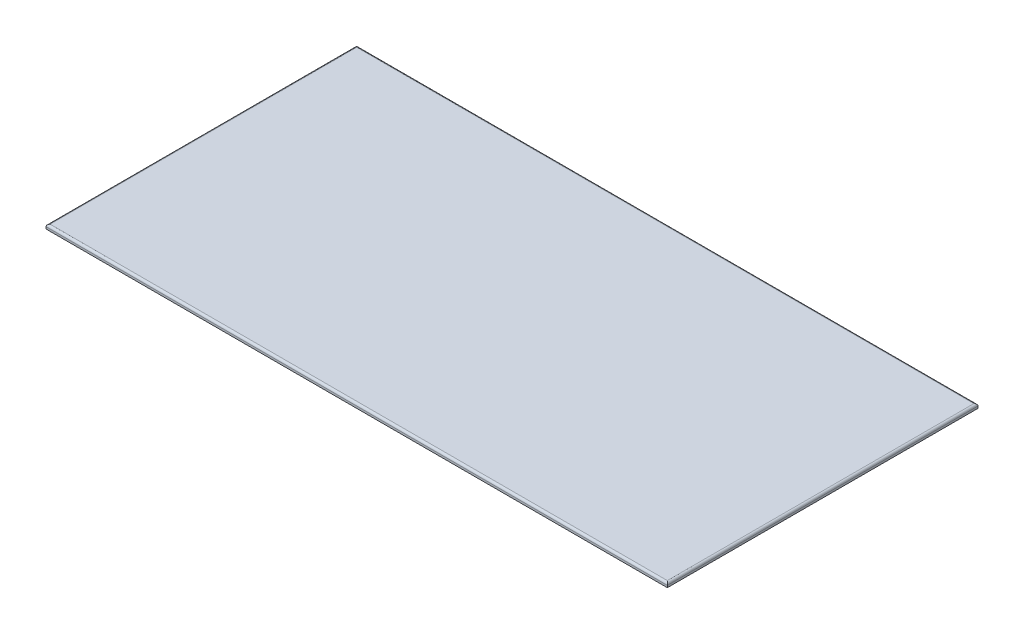
ISO-10303-21;
HEADER;
FILE_DESCRIPTION(('STEP AP214'),'2;1');
FILE_NAME('part.step','',(''),(''),'','','');
FILE_SCHEMA(('AUTOMOTIVE_DESIGN { 1 0 10303 214 1 1 1 1 }'));
ENDSEC;
DATA;
#1=APPLICATION_CONTEXT('core data for automotive mechanical design processes');
#2=APPLICATION_PROTOCOL_DEFINITION('international standard','automotive_design',2000,#1);
#3=PRODUCT_CONTEXT('',#1,'mechanical');
#4=PRODUCT('Part','Part','',(#3));
#5=PRODUCT_RELATED_PRODUCT_CATEGORY('part','',(#4));
#6=PRODUCT_DEFINITION_FORMATION('','',#4);
#7=PRODUCT_DEFINITION_CONTEXT('part definition',#1,'design');
#8=PRODUCT_DEFINITION('design','',#6,#7);
#9=PRODUCT_DEFINITION_SHAPE('','',#8);
#10=(LENGTH_UNIT() NAMED_UNIT(*) SI_UNIT(.MILLI.,.METRE.));
#11=(NAMED_UNIT(*) PLANE_ANGLE_UNIT() SI_UNIT($,.RADIAN.));
#12=(NAMED_UNIT(*) SI_UNIT($,.STERADIAN.) SOLID_ANGLE_UNIT());
#13=UNCERTAINTY_MEASURE_WITH_UNIT(LENGTH_MEASURE(1.E-05),#10,'distance_accuracy_value','');
#14=(GEOMETRIC_REPRESENTATION_CONTEXT(3) GLOBAL_UNCERTAINTY_ASSIGNED_CONTEXT((#13)) GLOBAL_UNIT_ASSIGNED_CONTEXT((#10,
#11,#12)) REPRESENTATION_CONTEXT('',''));
#15=CARTESIAN_POINT('',(0.,0.,0.));
#16=DIRECTION('',(0.,0.,1.));
#17=DIRECTION('',(1.,0.,0.));
#18=AXIS2_PLACEMENT_3D('',#15,#16,#17);
#19=CARTESIAN_POINT('',(0.,8.,0.));
#20=DIRECTION('',(1.,0.,0.));
#21=DIRECTION('',(0.,0.,-1.));
#22=AXIS2_PLACEMENT_3D('',#19,#20,#21);
#23=PLANE('',#22);
#24=DIRECTION('',(0.,-1.,0.));
#25=VECTOR('',#24,1.);
#26=CARTESIAN_POINT('',(0.,8.,0.));
#27=LINE('',#26,#25);
#28=CARTESIAN_POINT('',(0.,4.,0.));
#29=VERTEX_POINT('',#28);
#30=CARTESIAN_POINT('',(0.,0.,0.));
#31=VERTEX_POINT('',#30);
#32=EDGE_CURVE('E92',#29,#31,#27,.T.);
#33=ORIENTED_EDGE('',*,*,#32,.F.);
#34=DIRECTION('',(0.,0.,1.));
#35=VECTOR('',#34,1.);
#36=CARTESIAN_POINT('',(0.,4.,0.));
#37=LINE('',#36,#35);
#38=CARTESIAN_POINT('',(0.,4.,-600.));
#39=VERTEX_POINT('',#38);
#40=EDGE_CURVE('E11',#29,#39,#37,.F.);
#41=ORIENTED_EDGE('',*,*,#40,.T.);
#42=DIRECTION('',(0.,-1.,0.));
#43=VECTOR('',#42,1.);
#44=CARTESIAN_POINT('',(0.,8.,-600.));
#45=LINE('',#44,#43);
#46=CARTESIAN_POINT('',(0.,0.,-600.));
#47=VERTEX_POINT('',#46);
#48=EDGE_CURVE('E112',#39,#47,#45,.T.);
#49=ORIENTED_EDGE('',*,*,#48,.T.);
#50=DIRECTION('',(0.,0.,1.));
#51=VECTOR('',#50,1.);
#52=CARTESIAN_POINT('',(0.,0.,0.));
#53=LINE('',#52,#51);
#54=EDGE_CURVE('E107',#47,#31,#53,.T.);
#55=ORIENTED_EDGE('',*,*,#54,.T.);
#56=EDGE_LOOP('',(#33,#41,#49,#55));
#57=FACE_BOUND('',#56,.T.);
#58=ADVANCED_FACE('F40',(#57),#23,.F.);
#59=CARTESIAN_POINT('',(0.,8.,0.));
#60=DIRECTION('',(0.,0.,-1.));
#61=DIRECTION('',(-1.,0.,0.));
#62=AXIS2_PLACEMENT_3D('',#59,#60,#61);
#63=PLANE('',#62);
#64=DIRECTION('',(0.,-1.,0.));
#65=VECTOR('',#64,1.);
#66=CARTESIAN_POINT('',(1200.,8.,0.));
#67=LINE('',#66,#65);
#68=CARTESIAN_POINT('',(1200.,4.,0.));
#69=VERTEX_POINT('',#68);
#70=CARTESIAN_POINT('',(1200.,0.,0.));
#71=VERTEX_POINT('',#70);
#72=EDGE_CURVE('E101',#69,#71,#67,.T.);
#73=ORIENTED_EDGE('',*,*,#72,.F.);
#74=DIRECTION('',(1.,0.,0.));
#75=VECTOR('',#74,1.);
#76=CARTESIAN_POINT('',(0.,4.,0.));
#77=LINE('',#76,#75);
#78=EDGE_CURVE('E49',#69,#29,#77,.F.);
#79=ORIENTED_EDGE('',*,*,#78,.T.);
#80=ORIENTED_EDGE('',*,*,#32,.T.);
#81=DIRECTION('',(1.,0.,0.));
#82=VECTOR('',#81,1.);
#83=CARTESIAN_POINT('',(0.,0.,0.));
#84=LINE('',#83,#82);
#85=EDGE_CURVE('E95',#31,#71,#84,.T.);
#86=ORIENTED_EDGE('',*,*,#85,.T.);
#87=EDGE_LOOP('',(#73,#79,#80,#86));
#88=FACE_BOUND('',#87,.T.);
#89=ADVANCED_FACE('F94',(#88),#63,.F.);
#90=CARTESIAN_POINT('',(1200.,8.,0.));
#91=DIRECTION('',(-1.,0.,0.));
#92=DIRECTION('',(0.,0.,1.));
#93=AXIS2_PLACEMENT_3D('',#90,#91,#92);
#94=PLANE('',#93);
#95=DIRECTION('',(0.,-1.,0.));
#96=VECTOR('',#95,1.);
#97=CARTESIAN_POINT('',(1200.,8.,-600.));
#98=LINE('',#97,#96);
#99=CARTESIAN_POINT('',(1200.,4.,-600.));
#100=VERTEX_POINT('',#99);
#101=CARTESIAN_POINT('',(1200.,0.,-600.));
#102=VERTEX_POINT('',#101);
#103=EDGE_CURVE('E122',#100,#102,#98,.T.);
#104=ORIENTED_EDGE('',*,*,#103,.F.);
#105=DIRECTION('',(0.,0.,-1.));
#106=VECTOR('',#105,1.);
#107=CARTESIAN_POINT('',(1200.,4.,0.));
#108=LINE('',#107,#106);
#109=EDGE_CURVE('E64',#100,#69,#108,.F.);
#110=ORIENTED_EDGE('',*,*,#109,.T.);
#111=ORIENTED_EDGE('',*,*,#72,.T.);
#112=DIRECTION('',(0.,0.,-1.));
#113=VECTOR('',#112,1.);
#114=CARTESIAN_POINT('',(1200.,0.,0.));
#115=LINE('',#114,#113);
#116=EDGE_CURVE('E109',#71,#102,#115,.T.);
#117=ORIENTED_EDGE('',*,*,#116,.T.);
#118=EDGE_LOOP('',(#104,#110,#111,#117));
#119=FACE_BOUND('',#118,.T.);
#120=ADVANCED_FACE('F160',(#119),#94,.F.);
#121=CARTESIAN_POINT('',(0.,8.,-600.));
#122=DIRECTION('',(0.,0.,1.));
#123=DIRECTION('',(1.,0.,0.));
#124=AXIS2_PLACEMENT_3D('',#121,#122,#123);
#125=PLANE('',#124);
#126=ORIENTED_EDGE('',*,*,#48,.F.);
#127=DIRECTION('',(-1.,0.,0.));
#128=VECTOR('',#127,1.);
#129=CARTESIAN_POINT('',(0.,4.,-600.));
#130=LINE('',#129,#128);
#131=EDGE_CURVE('E133',#39,#100,#130,.F.);
#132=ORIENTED_EDGE('',*,*,#131,.T.);
#133=ORIENTED_EDGE('',*,*,#103,.T.);
#134=DIRECTION('',(-1.,0.,0.));
#135=VECTOR('',#134,1.);
#136=CARTESIAN_POINT('',(0.,0.,-600.));
#137=LINE('',#136,#135);
#138=EDGE_CURVE('E119',#102,#47,#137,.T.);
#139=ORIENTED_EDGE('',*,*,#138,.T.);
#140=EDGE_LOOP('',(#126,#132,#133,#139));
#141=FACE_BOUND('',#140,.T.);
#142=ADVANCED_FACE('F159',(#141),#125,.F.);
#143=CARTESIAN_POINT('',(0.,8.,0.));
#144=DIRECTION('',(0.,-1.,0.));
#145=DIRECTION('',(0.,0.,-1.));
#146=AXIS2_PLACEMENT_3D('',#143,#144,#145);
#147=PLANE('',#146);
#148=DIRECTION('',(0.,0.,-1.));
#149=VECTOR('',#148,1.);
#150=CARTESIAN_POINT('',(1196.,8.,0.));
#151=LINE('',#150,#149);
#152=CARTESIAN_POINT('',(1196.,8.,-4.));
#153=VERTEX_POINT('',#152);
#154=CARTESIAN_POINT('',(1196.,8.,-596.));
#155=VERTEX_POINT('',#154);
#156=EDGE_CURVE('E128',#153,#155,#151,.T.);
#157=ORIENTED_EDGE('',*,*,#156,.T.);
#158=DIRECTION('',(-1.,0.,0.));
#159=VECTOR('',#158,1.);
#160=CARTESIAN_POINT('',(0.,8.,-596.));
#161=LINE('',#160,#159);
#162=CARTESIAN_POINT('',(4.,8.,-596.));
#163=VERTEX_POINT('',#162);
#164=EDGE_CURVE('E130',#155,#163,#161,.T.);
#165=ORIENTED_EDGE('',*,*,#164,.T.);
#166=DIRECTION('',(0.,0.,1.));
#167=VECTOR('',#166,1.);
#168=CARTESIAN_POINT('',(4.,8.,0.));
#169=LINE('',#168,#167);
#170=CARTESIAN_POINT('',(4.,8.,-4.));
#171=VERTEX_POINT('',#170);
#172=EDGE_CURVE('E100',#163,#171,#169,.T.);
#173=ORIENTED_EDGE('',*,*,#172,.T.);
#174=DIRECTION('',(1.,0.,0.));
#175=VECTOR('',#174,1.);
#176=CARTESIAN_POINT('',(0.,8.,-4.));
#177=LINE('',#176,#175);
#178=EDGE_CURVE('E126',#171,#153,#177,.T.);
#179=ORIENTED_EDGE('',*,*,#178,.T.);
#180=EDGE_LOOP('',(#157,#165,#173,#179));
#181=FACE_BOUND('',#180,.T.);
#182=ADVANCED_FACE('F152',(#181),#147,.F.);
#183=CARTESIAN_POINT('',(0.,0.,0.));
#184=DIRECTION('',(0.,-1.,0.));
#185=DIRECTION('',(0.,0.,-1.));
#186=AXIS2_PLACEMENT_3D('',#183,#184,#185);
#187=PLANE('',#186);
#188=ORIENTED_EDGE('',*,*,#54,.F.);
#189=ORIENTED_EDGE('',*,*,#138,.F.);
#190=ORIENTED_EDGE('',*,*,#116,.F.);
#191=ORIENTED_EDGE('',*,*,#85,.F.);
#192=EDGE_LOOP('',(#188,#189,#190,#191));
#193=FACE_BOUND('',#192,.T.);
#194=ADVANCED_FACE('F105',(#193),#187,.T.);
#195=CARTESIAN_POINT('',(0.,4.,-4.));
#196=DIRECTION('',(1.,0.,0.));
#197=DIRECTION('',(0.,0.,-1.));
#198=AXIS2_PLACEMENT_3D('',#195,#196,#197);
#199=CYLINDRICAL_SURFACE('',#198,4.);
#200=CARTESIAN_POINT('',(4.,4.,-4.));
#201=DIRECTION('',(0.707106781186547,0.,0.707106781186547));
#202=DIRECTION('',(-0.707106781186547,0.,0.707106781186547));
#203=AXIS2_PLACEMENT_3D('',#200,#201,#202);
#204=ELLIPSE('',#203,5.65685424949238,4.);
#205=EDGE_CURVE('E116',#29,#171,#204,.F.);
#206=ORIENTED_EDGE('',*,*,#205,.F.);
#207=ORIENTED_EDGE('',*,*,#78,.F.);
#208=CARTESIAN_POINT('',(1196.,4.,-4.));
#209=DIRECTION('',(0.707106781186547,0.,-0.707106781186547));
#210=DIRECTION('',(0.707106781186547,0.,0.707106781186547));
#211=AXIS2_PLACEMENT_3D('',#208,#209,#210);
#212=ELLIPSE('',#211,5.65685424949238,4.);
#213=EDGE_CURVE('E44',#153,#69,#212,.T.);
#214=ORIENTED_EDGE('',*,*,#213,.F.);
#215=ORIENTED_EDGE('',*,*,#178,.F.);
#216=EDGE_LOOP('',(#206,#207,#214,#215));
#217=FACE_BOUND('',#216,.T.);
#218=ADVANCED_FACE('F42',(#217),#199,.T.);
#219=CARTESIAN_POINT('',(1196.,4.,0.));
#220=DIRECTION('',(0.,0.,-1.));
#221=DIRECTION('',(-1.,0.,0.));
#222=AXIS2_PLACEMENT_3D('',#219,#220,#221);
#223=CYLINDRICAL_SURFACE('',#222,4.);
#224=ORIENTED_EDGE('',*,*,#213,.T.);
#225=ORIENTED_EDGE('',*,*,#109,.F.);
#226=CARTESIAN_POINT('',(1196.,4.,-596.));
#227=DIRECTION('',(-0.707106781186547,0.,-0.707106781186547));
#228=DIRECTION('',(0.707106781186547,0.,-0.707106781186547));
#229=AXIS2_PLACEMENT_3D('',#226,#227,#228);
#230=ELLIPSE('',#229,5.65685424949238,4.);
#231=EDGE_CURVE('E140',#155,#100,#230,.T.);
#232=ORIENTED_EDGE('',*,*,#231,.F.);
#233=ORIENTED_EDGE('',*,*,#156,.F.);
#234=EDGE_LOOP('',(#224,#225,#232,#233));
#235=FACE_BOUND('',#234,.T.);
#236=ADVANCED_FACE('F177',(#235),#223,.T.);
#237=CARTESIAN_POINT('',(4.,4.,0.));
#238=DIRECTION('',(0.,0.,1.));
#239=DIRECTION('',(1.,0.,0.));
#240=AXIS2_PLACEMENT_3D('',#237,#238,#239);
#241=CYLINDRICAL_SURFACE('',#240,4.);
#242=ORIENTED_EDGE('',*,*,#205,.T.);
#243=ORIENTED_EDGE('',*,*,#172,.F.);
#244=CARTESIAN_POINT('',(4.,4.,-596.));
#245=DIRECTION('',(-0.707106781186547,0.,0.707106781186547));
#246=DIRECTION('',(0.707106781186547,0.,0.707106781186547));
#247=AXIS2_PLACEMENT_3D('',#244,#245,#246);
#248=ELLIPSE('',#247,5.65685424949238,4.);
#249=EDGE_CURVE('E138',#39,#163,#248,.F.);
#250=ORIENTED_EDGE('',*,*,#249,.F.);
#251=ORIENTED_EDGE('',*,*,#40,.F.);
#252=EDGE_LOOP('',(#242,#243,#250,#251));
#253=FACE_BOUND('',#252,.T.);
#254=ADVANCED_FACE('F145',(#253),#241,.T.);
#255=CARTESIAN_POINT('',(0.,4.,-596.));
#256=DIRECTION('',(-1.,0.,0.));
#257=DIRECTION('',(0.,0.,1.));
#258=AXIS2_PLACEMENT_3D('',#255,#256,#257);
#259=CYLINDRICAL_SURFACE('',#258,4.);
#260=ORIENTED_EDGE('',*,*,#231,.T.);
#261=ORIENTED_EDGE('',*,*,#131,.F.);
#262=ORIENTED_EDGE('',*,*,#249,.T.);
#263=ORIENTED_EDGE('',*,*,#164,.F.);
#264=EDGE_LOOP('',(#260,#261,#262,#263));
#265=FACE_BOUND('',#264,.T.);
#266=ADVANCED_FACE('F156',(#265),#259,.T.);
#267=CLOSED_SHELL('',(#58,#89,#120,#142,#182,#194,#218,#236,#254,#266));
#268=MANIFOLD_SOLID_BREP('B2',#267);
#269=ADVANCED_BREP_SHAPE_REPRESENTATION('',(#18,#268),#14);
#270=SHAPE_DEFINITION_REPRESENTATION(#9,#269);
ENDSEC;
END-ISO-10303-21;
